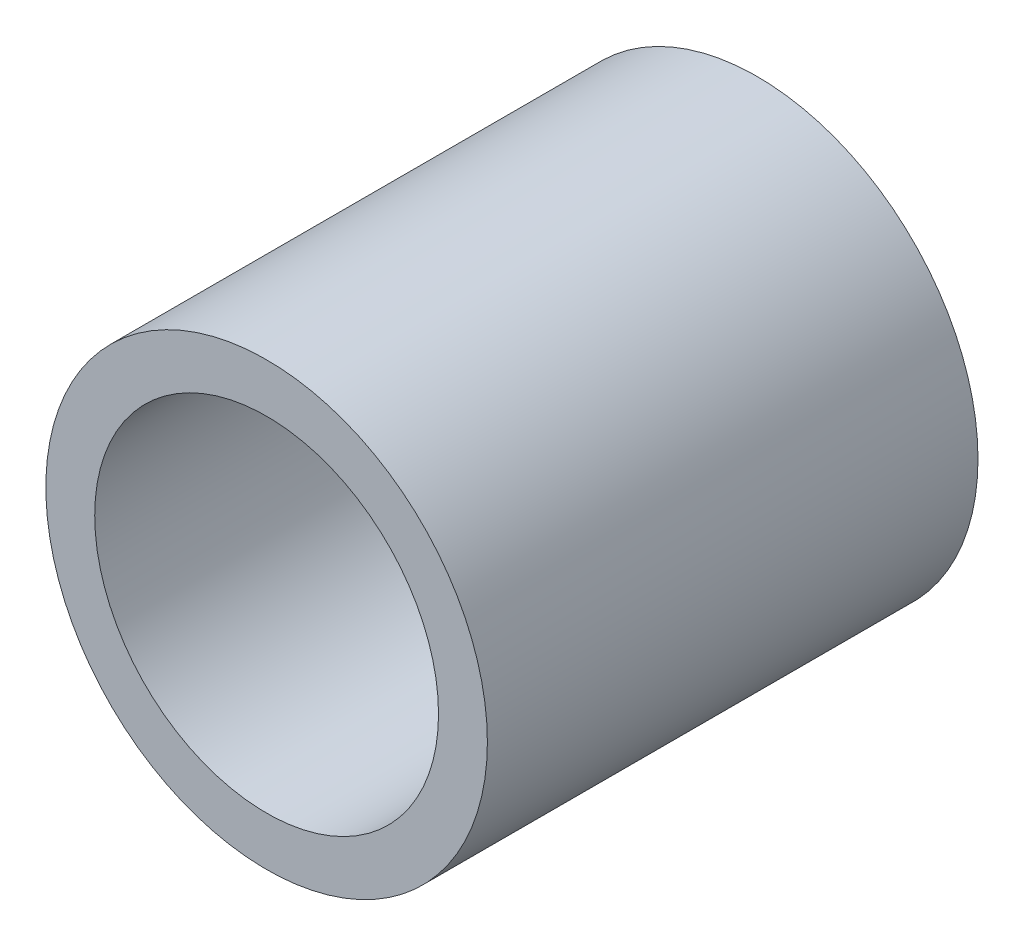
ISO-10303-21;
HEADER;
FILE_DESCRIPTION(('STEP AP214'),'2;1');
FILE_NAME('part.step','',(''),(''),'','','');
FILE_SCHEMA(('AUTOMOTIVE_DESIGN { 1 0 10303 214 1 1 1 1 }'));
ENDSEC;
DATA;
#1=APPLICATION_CONTEXT('core data for automotive mechanical design processes');
#2=APPLICATION_PROTOCOL_DEFINITION('international standard','automotive_design',2000,#1);
#3=PRODUCT_CONTEXT('',#1,'mechanical');
#4=PRODUCT('Part','Part','',(#3));
#5=PRODUCT_RELATED_PRODUCT_CATEGORY('part','',(#4));
#6=PRODUCT_DEFINITION_FORMATION('','',#4);
#7=PRODUCT_DEFINITION_CONTEXT('part definition',#1,'design');
#8=PRODUCT_DEFINITION('design','',#6,#7);
#9=PRODUCT_DEFINITION_SHAPE('','',#8);
#10=(LENGTH_UNIT() NAMED_UNIT(*) SI_UNIT(.MILLI.,.METRE.));
#11=(NAMED_UNIT(*) PLANE_ANGLE_UNIT() SI_UNIT($,.RADIAN.));
#12=(NAMED_UNIT(*) SI_UNIT($,.STERADIAN.) SOLID_ANGLE_UNIT());
#13=UNCERTAINTY_MEASURE_WITH_UNIT(LENGTH_MEASURE(1.E-05),#10,'distance_accuracy_value','');
#14=(GEOMETRIC_REPRESENTATION_CONTEXT(3) GLOBAL_UNCERTAINTY_ASSIGNED_CONTEXT((#13)) GLOBAL_UNIT_ASSIGNED_CONTEXT((#10,
#11,#12)) REPRESENTATION_CONTEXT('',''));
#15=CARTESIAN_POINT('',(0.,0.,0.));
#16=DIRECTION('',(0.,0.,1.));
#17=DIRECTION('',(1.,0.,0.));
#18=AXIS2_PLACEMENT_3D('',#15,#16,#17);
#19=CARTESIAN_POINT('',(0.,0.,7.9375));
#20=DIRECTION('',(0.,0.,1.));
#21=DIRECTION('',(1.,0.,0.));
#22=AXIS2_PLACEMENT_3D('',#19,#20,#21);
#23=PLANE('',#22);
#24=CARTESIAN_POINT('',(0.,0.,7.9375));
#25=DIRECTION('',(0.,0.,1.));
#26=DIRECTION('',(1.,0.,0.));
#27=AXIS2_PLACEMENT_3D('',#24,#25,#26);
#28=CIRCLE('',#27,7.14375);
#29=CARTESIAN_POINT('',(7.14375,0.,7.9375));
#30=VERTEX_POINT('',#29);
#31=EDGE_CURVE('E10',#30,#30,#28,.T.);
#32=ORIENTED_EDGE('',*,*,#31,.T.);
#33=EDGE_LOOP('',(#32));
#34=FACE_BOUND('',#33,.T.);
#35=CARTESIAN_POINT('',(0.,0.,7.9375));
#36=DIRECTION('',(0.,0.,1.));
#37=DIRECTION('',(1.,0.,0.));
#38=AXIS2_PLACEMENT_3D('',#35,#36,#37);
#39=CIRCLE('',#38,5.5626);
#40=CARTESIAN_POINT('',(5.5626,0.,7.9375));
#41=VERTEX_POINT('',#40);
#42=EDGE_CURVE('E41',#41,#41,#39,.T.);
#43=ORIENTED_EDGE('',*,*,#42,.F.);
#44=EDGE_LOOP('',(#43));
#45=FACE_BOUND('',#44,.T.);
#46=ADVANCED_FACE('F30',(#34,#45),#23,.T.);
#47=CARTESIAN_POINT('',(0.,0.,-7.9375));
#48=DIRECTION('',(0.,0.,1.));
#49=DIRECTION('',(1.,0.,0.));
#50=AXIS2_PLACEMENT_3D('',#47,#48,#49);
#51=PLANE('',#50);
#52=CARTESIAN_POINT('',(0.,0.,-7.9375));
#53=DIRECTION('',(0.,0.,1.));
#54=DIRECTION('',(1.,0.,0.));
#55=AXIS2_PLACEMENT_3D('',#52,#53,#54);
#56=CIRCLE('',#55,7.14375);
#57=CARTESIAN_POINT('',(7.14375,0.,-7.9375));
#58=VERTEX_POINT('',#57);
#59=EDGE_CURVE('E34',#58,#58,#56,.T.);
#60=ORIENTED_EDGE('',*,*,#59,.F.);
#61=EDGE_LOOP('',(#60));
#62=FACE_BOUND('',#61,.T.);
#63=CARTESIAN_POINT('',(0.,0.,-7.9375));
#64=DIRECTION('',(0.,0.,1.));
#65=DIRECTION('',(1.,0.,0.));
#66=AXIS2_PLACEMENT_3D('',#63,#64,#65);
#67=CIRCLE('',#66,5.5626);
#68=CARTESIAN_POINT('',(5.5626,0.,-7.9375));
#69=VERTEX_POINT('',#68);
#70=EDGE_CURVE('E43',#69,#69,#67,.T.);
#71=ORIENTED_EDGE('',*,*,#70,.T.);
#72=EDGE_LOOP('',(#71));
#73=FACE_BOUND('',#72,.T.);
#74=ADVANCED_FACE('F53',(#62,#73),#51,.F.);
#75=CARTESIAN_POINT('',(0.,0.,7.9375));
#76=DIRECTION('',(0.,0.,-1.));
#77=DIRECTION('',(-1.,0.,0.));
#78=AXIS2_PLACEMENT_3D('',#75,#76,#77);
#79=CYLINDRICAL_SURFACE('',#78,7.14375);
#80=ORIENTED_EDGE('',*,*,#31,.F.);
#81=EDGE_LOOP('',(#80));
#82=FACE_BOUND('',#81,.T.);
#83=ORIENTED_EDGE('',*,*,#59,.T.);
#84=EDGE_LOOP('',(#83));
#85=FACE_BOUND('',#84,.T.);
#86=ADVANCED_FACE('F32',(#82,#85),#79,.T.);
#87=CARTESIAN_POINT('',(0.,0.,7.9375));
#88=DIRECTION('',(0.,0.,-1.));
#89=DIRECTION('',(-1.,0.,0.));
#90=AXIS2_PLACEMENT_3D('',#87,#88,#89);
#91=CYLINDRICAL_SURFACE('',#90,5.5626);
#92=ORIENTED_EDGE('',*,*,#42,.T.);
#93=EDGE_LOOP('',(#92));
#94=FACE_BOUND('',#93,.T.);
#95=ORIENTED_EDGE('',*,*,#70,.F.);
#96=EDGE_LOOP('',(#95));
#97=FACE_BOUND('',#96,.T.);
#98=ADVANCED_FACE('F49',(#94,#97),#91,.F.);
#99=CLOSED_SHELL('',(#46,#74,#86,#98));
#100=MANIFOLD_SOLID_BREP('B2',#99);
#101=ADVANCED_BREP_SHAPE_REPRESENTATION('',(#18,#100),#14);
#102=SHAPE_DEFINITION_REPRESENTATION(#9,#101);
ENDSEC;
END-ISO-10303-21;
